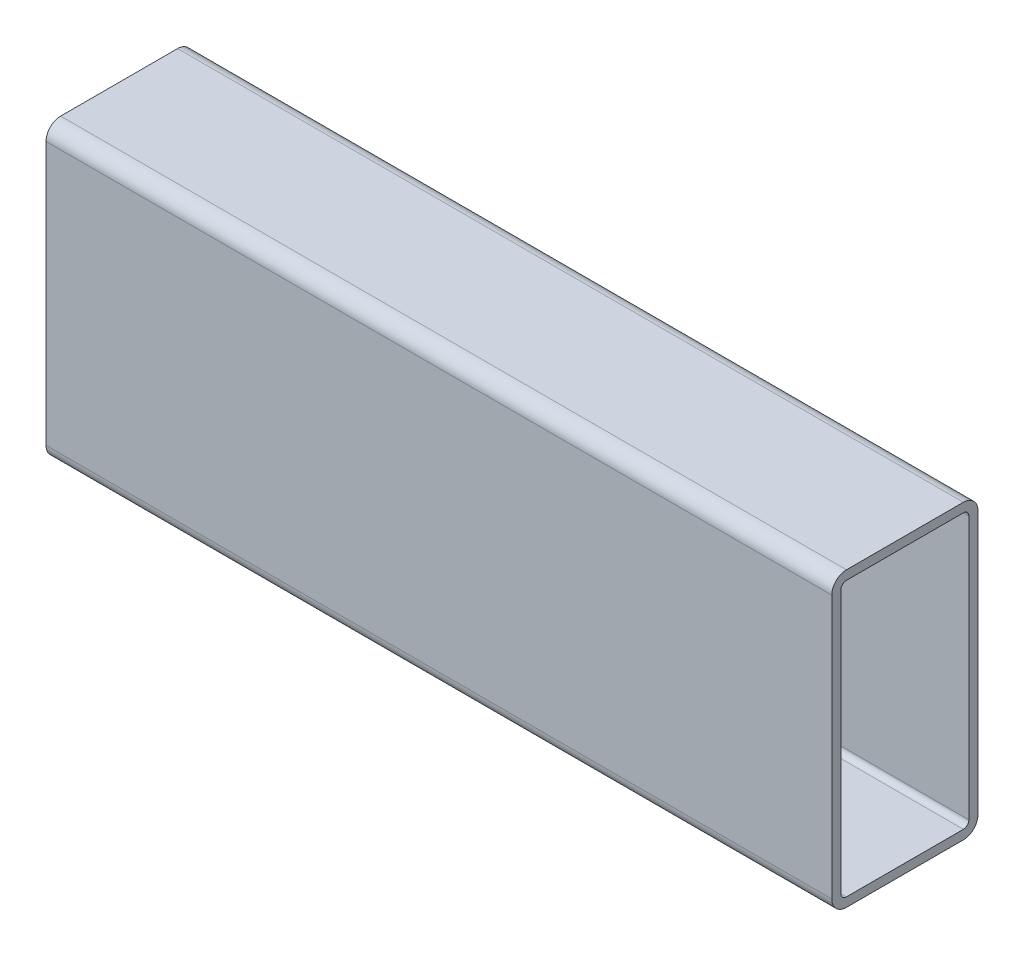
ISO-10303-21;
HEADER;
FILE_DESCRIPTION(('STEP AP214'),'2;1');
FILE_NAME('part.step','',(''),(''),'','','');
FILE_SCHEMA(('AUTOMOTIVE_DESIGN { 1 0 10303 214 1 1 1 1 }'));
ENDSEC;
DATA;
#1=APPLICATION_CONTEXT('core data for automotive mechanical design processes');
#2=APPLICATION_PROTOCOL_DEFINITION('international standard','automotive_design',2000,#1);
#3=PRODUCT_CONTEXT('',#1,'mechanical');
#4=PRODUCT('Part','Part','',(#3));
#5=PRODUCT_RELATED_PRODUCT_CATEGORY('part','',(#4));
#6=PRODUCT_DEFINITION_FORMATION('','',#4);
#7=PRODUCT_DEFINITION_CONTEXT('part definition',#1,'design');
#8=PRODUCT_DEFINITION('design','',#6,#7);
#9=PRODUCT_DEFINITION_SHAPE('','',#8);
#10=(LENGTH_UNIT() NAMED_UNIT(*) SI_UNIT(.MILLI.,.METRE.));
#11=(NAMED_UNIT(*) PLANE_ANGLE_UNIT() SI_UNIT($,.RADIAN.));
#12=(NAMED_UNIT(*) SI_UNIT($,.STERADIAN.) SOLID_ANGLE_UNIT());
#13=UNCERTAINTY_MEASURE_WITH_UNIT(LENGTH_MEASURE(1.E-05),#10,'distance_accuracy_value','');
#14=(GEOMETRIC_REPRESENTATION_CONTEXT(3) GLOBAL_UNCERTAINTY_ASSIGNED_CONTEXT((#13)) GLOBAL_UNIT_ASSIGNED_CONTEXT((#10,
#11,#12)) REPRESENTATION_CONTEXT('',''));
#15=CARTESIAN_POINT('',(0.,0.,0.));
#16=DIRECTION('',(0.,0.,1.));
#17=DIRECTION('',(1.,0.,0.));
#18=AXIS2_PLACEMENT_3D('',#15,#16,#17);
#19=CARTESIAN_POINT('',(68.2625,-22.86,10.16));
#20=DIRECTION('',(1.,0.,0.));
#21=DIRECTION('',(0.,0.,-1.));
#22=AXIS2_PLACEMENT_3D('',#19,#20,#21);
#23=PLANE('',#22);
#24=CARTESIAN_POINT('',(68.2625,-22.86,10.16));
#25=DIRECTION('',(1.,0.,0.));
#26=DIRECTION('',(0.,0.,1.));
#27=AXIS2_PLACEMENT_3D('',#24,#25,#26);
#28=CIRCLE('',#27,2.54);
#29=CARTESIAN_POINT('',(68.2625,-22.86,12.7));
#30=VERTEX_POINT('',#29);
#31=CARTESIAN_POINT('',(68.2625,-25.4,10.16));
#32=VERTEX_POINT('',#31);
#33=EDGE_CURVE('E265',#30,#32,#28,.T.);
#34=ORIENTED_EDGE('',*,*,#33,.T.);
#35=DIRECTION('',(0.,0.,-1.));
#36=VECTOR('',#35,1.);
#37=CARTESIAN_POINT('',(68.2625,-25.4,10.16));
#38=LINE('',#37,#36);
#39=CARTESIAN_POINT('',(68.2625,-25.4,-10.16));
#40=VERTEX_POINT('',#39);
#41=EDGE_CURVE('E268',#32,#40,#38,.T.);
#42=ORIENTED_EDGE('',*,*,#41,.T.);
#43=CARTESIAN_POINT('',(68.2625,-22.86,-10.16));
#44=DIRECTION('',(1.,0.,0.));
#45=DIRECTION('',(0.,0.,-1.));
#46=AXIS2_PLACEMENT_3D('',#43,#44,#45);
#47=CIRCLE('',#46,2.54);
#48=CARTESIAN_POINT('',(68.2625,-22.86,-12.7));
#49=VERTEX_POINT('',#48);
#50=EDGE_CURVE('E271',#40,#49,#47,.T.);
#51=ORIENTED_EDGE('',*,*,#50,.T.);
#52=DIRECTION('',(0.,1.,0.));
#53=VECTOR('',#52,1.);
#54=CARTESIAN_POINT('',(68.2625,-22.86,-12.7));
#55=LINE('',#54,#53);
#56=CARTESIAN_POINT('',(68.2625,22.86,-12.7));
#57=VERTEX_POINT('',#56);
#58=EDGE_CURVE('E273',#49,#57,#55,.T.);
#59=ORIENTED_EDGE('',*,*,#58,.T.);
#60=CARTESIAN_POINT('',(68.2625,22.86,-10.16));
#61=DIRECTION('',(1.,0.,0.));
#62=DIRECTION('',(0.,0.,1.));
#63=AXIS2_PLACEMENT_3D('',#60,#61,#62);
#64=CIRCLE('',#63,2.54);
#65=CARTESIAN_POINT('',(68.2625,25.4,-10.16));
#66=VERTEX_POINT('',#65);
#67=EDGE_CURVE('E275',#57,#66,#64,.T.);
#68=ORIENTED_EDGE('',*,*,#67,.T.);
#69=DIRECTION('',(0.,0.,1.));
#70=VECTOR('',#69,1.);
#71=CARTESIAN_POINT('',(68.2625,25.4,10.16));
#72=LINE('',#71,#70);
#73=CARTESIAN_POINT('',(68.2625,25.4,10.16));
#74=VERTEX_POINT('',#73);
#75=EDGE_CURVE('E277',#66,#74,#72,.T.);
#76=ORIENTED_EDGE('',*,*,#75,.T.);
#77=CARTESIAN_POINT('',(68.2625,22.86,10.16));
#78=DIRECTION('',(1.,0.,0.));
#79=DIRECTION('',(0.,0.,1.));
#80=AXIS2_PLACEMENT_3D('',#77,#78,#79);
#81=CIRCLE('',#80,2.54);
#82=CARTESIAN_POINT('',(68.2625,22.86,12.7));
#83=VERTEX_POINT('',#82);
#84=EDGE_CURVE('E279',#74,#83,#81,.T.);
#85=ORIENTED_EDGE('',*,*,#84,.T.);
#86=DIRECTION('',(0.,-1.,0.));
#87=VECTOR('',#86,1.);
#88=CARTESIAN_POINT('',(68.2625,-22.86,12.7));
#89=LINE('',#88,#87);
#90=EDGE_CURVE('E281',#83,#30,#89,.T.);
#91=ORIENTED_EDGE('',*,*,#90,.T.);
#92=EDGE_LOOP('',(#34,#42,#51,#59,#68,#76,#85,#91));
#93=FACE_BOUND('',#92,.T.);
#94=DIRECTION('',(0.,0.,-1.));
#95=VECTOR('',#94,1.);
#96=CARTESIAN_POINT('',(68.2625,-23.8125,10.16));
#97=LINE('',#96,#95);
#98=CARTESIAN_POINT('',(68.2625,-23.8125,10.16));
#99=VERTEX_POINT('',#98);
#100=CARTESIAN_POINT('',(68.2625,-23.8125,-10.16));
#101=VERTEX_POINT('',#100);
#102=EDGE_CURVE('E208',#99,#101,#97,.T.);
#103=ORIENTED_EDGE('',*,*,#102,.F.);
#104=CARTESIAN_POINT('',(68.2625,-22.86,10.16));
#105=DIRECTION('',(-1.,0.,0.));
#106=DIRECTION('',(0.,0.,1.));
#107=AXIS2_PLACEMENT_3D('',#104,#105,#106);
#108=CIRCLE('',#107,0.952500000000001);
#109=CARTESIAN_POINT('',(68.2625,-22.86,11.1125));
#110=VERTEX_POINT('',#109);
#111=EDGE_CURVE('E200',#110,#99,#108,.F.);
#112=ORIENTED_EDGE('',*,*,#111,.F.);
#113=DIRECTION('',(0.,-1.,0.));
#114=VECTOR('',#113,1.);
#115=CARTESIAN_POINT('',(68.2625,-22.86,11.1125));
#116=LINE('',#115,#114);
#117=CARTESIAN_POINT('',(68.2625,22.86,11.1125));
#118=VERTEX_POINT('',#117);
#119=EDGE_CURVE('E233',#118,#110,#116,.T.);
#120=ORIENTED_EDGE('',*,*,#119,.F.);
#121=CARTESIAN_POINT('',(68.2625,22.86,10.16));
#122=DIRECTION('',(-1.,0.,0.));
#123=DIRECTION('',(0.,0.,1.));
#124=AXIS2_PLACEMENT_3D('',#121,#122,#123);
#125=CIRCLE('',#124,0.952500000000001);
#126=CARTESIAN_POINT('',(68.2625,23.8125,10.16));
#127=VERTEX_POINT('',#126);
#128=EDGE_CURVE('E231',#127,#118,#125,.F.);
#129=ORIENTED_EDGE('',*,*,#128,.F.);
#130=DIRECTION('',(0.,0.,1.));
#131=VECTOR('',#130,1.);
#132=CARTESIAN_POINT('',(68.2625,23.8125,10.16));
#133=LINE('',#132,#131);
#134=CARTESIAN_POINT('',(68.2625,23.8125,-10.16));
#135=VERTEX_POINT('',#134);
#136=EDGE_CURVE('E229',#135,#127,#133,.T.);
#137=ORIENTED_EDGE('',*,*,#136,.F.);
#138=CARTESIAN_POINT('',(68.2625,22.86,-10.16));
#139=DIRECTION('',(-1.,0.,0.));
#140=DIRECTION('',(0.,0.,1.));
#141=AXIS2_PLACEMENT_3D('',#138,#139,#140);
#142=CIRCLE('',#141,0.952500000000001);
#143=CARTESIAN_POINT('',(68.2625,22.86,-11.1125));
#144=VERTEX_POINT('',#143);
#145=EDGE_CURVE('E227',#144,#135,#142,.F.);
#146=ORIENTED_EDGE('',*,*,#145,.F.);
#147=DIRECTION('',(0.,1.,0.));
#148=VECTOR('',#147,1.);
#149=CARTESIAN_POINT('',(68.2625,-22.86,-11.1125));
#150=LINE('',#149,#148);
#151=CARTESIAN_POINT('',(68.2625,-22.86,-11.1125));
#152=VERTEX_POINT('',#151);
#153=EDGE_CURVE('E223',#152,#144,#150,.T.);
#154=ORIENTED_EDGE('',*,*,#153,.F.);
#155=CARTESIAN_POINT('',(68.2625,-22.86,-10.16));
#156=DIRECTION('',(-1.,0.,0.));
#157=DIRECTION('',(0.,0.,1.));
#158=AXIS2_PLACEMENT_3D('',#155,#156,#157);
#159=CIRCLE('',#158,0.952500000000001);
#160=EDGE_CURVE('E221',#101,#152,#159,.F.);
#161=ORIENTED_EDGE('',*,*,#160,.F.);
#162=EDGE_LOOP('',(#103,#112,#120,#129,#137,#146,#154,#161));
#163=FACE_BOUND('',#162,.T.);
#164=ADVANCED_FACE('F87',(#93,#163),#23,.T.);
#165=CARTESIAN_POINT('',(-68.2625,-22.86,10.16));
#166=DIRECTION('',(1.,0.,0.));
#167=DIRECTION('',(0.,0.,-1.));
#168=AXIS2_PLACEMENT_3D('',#165,#166,#167);
#169=PLANE('',#168);
#170=CARTESIAN_POINT('',(-68.2625,-22.86,10.16));
#171=DIRECTION('',(1.,0.,0.));
#172=DIRECTION('',(0.,0.,1.));
#173=AXIS2_PLACEMENT_3D('',#170,#171,#172);
#174=CIRCLE('',#173,2.54);
#175=CARTESIAN_POINT('',(-68.2625,-22.86,12.7));
#176=VERTEX_POINT('',#175);
#177=CARTESIAN_POINT('',(-68.2625,-25.4,10.16));
#178=VERTEX_POINT('',#177);
#179=EDGE_CURVE('E216',#176,#178,#174,.T.);
#180=ORIENTED_EDGE('',*,*,#179,.F.);
#181=DIRECTION('',(0.,-1.,0.));
#182=VECTOR('',#181,1.);
#183=CARTESIAN_POINT('',(-68.2625,-22.86,12.7));
#184=LINE('',#183,#182);
#185=CARTESIAN_POINT('',(-68.2625,22.86,12.7));
#186=VERTEX_POINT('',#185);
#187=EDGE_CURVE('E269',#186,#176,#184,.T.);
#188=ORIENTED_EDGE('',*,*,#187,.F.);
#189=CARTESIAN_POINT('',(-68.2625,22.86,10.16));
#190=DIRECTION('',(1.,0.,0.));
#191=DIRECTION('',(0.,0.,1.));
#192=AXIS2_PLACEMENT_3D('',#189,#190,#191);
#193=CIRCLE('',#192,2.54);
#194=CARTESIAN_POINT('',(-68.2625,25.4,10.16));
#195=VERTEX_POINT('',#194);
#196=EDGE_CURVE('E296',#195,#186,#193,.T.);
#197=ORIENTED_EDGE('',*,*,#196,.F.);
#198=DIRECTION('',(0.,0.,1.));
#199=VECTOR('',#198,1.);
#200=CARTESIAN_POINT('',(-68.2625,25.4,10.16));
#201=LINE('',#200,#199);
#202=CARTESIAN_POINT('',(-68.2625,25.4,-10.16));
#203=VERTEX_POINT('',#202);
#204=EDGE_CURVE('E294',#203,#195,#201,.T.);
#205=ORIENTED_EDGE('',*,*,#204,.F.);
#206=CARTESIAN_POINT('',(-68.2625,22.86,-10.16));
#207=DIRECTION('',(1.,0.,0.));
#208=DIRECTION('',(0.,0.,1.));
#209=AXIS2_PLACEMENT_3D('',#206,#207,#208);
#210=CIRCLE('',#209,2.54);
#211=CARTESIAN_POINT('',(-68.2625,22.86,-12.7));
#212=VERTEX_POINT('',#211);
#213=EDGE_CURVE('E292',#212,#203,#210,.T.);
#214=ORIENTED_EDGE('',*,*,#213,.F.);
#215=DIRECTION('',(0.,1.,0.));
#216=VECTOR('',#215,1.);
#217=CARTESIAN_POINT('',(-68.2625,-22.86,-12.7));
#218=LINE('',#217,#216);
#219=CARTESIAN_POINT('',(-68.2625,-22.86,-12.7));
#220=VERTEX_POINT('',#219);
#221=EDGE_CURVE('E290',#220,#212,#218,.T.);
#222=ORIENTED_EDGE('',*,*,#221,.F.);
#223=CARTESIAN_POINT('',(-68.2625,-22.86,-10.16));
#224=DIRECTION('',(1.,0.,0.));
#225=DIRECTION('',(0.,0.,-1.));
#226=AXIS2_PLACEMENT_3D('',#223,#224,#225);
#227=CIRCLE('',#226,2.54);
#228=CARTESIAN_POINT('',(-68.2625,-25.4,-10.16));
#229=VERTEX_POINT('',#228);
#230=EDGE_CURVE('E288',#229,#220,#227,.T.);
#231=ORIENTED_EDGE('',*,*,#230,.F.);
#232=DIRECTION('',(0.,0.,-1.));
#233=VECTOR('',#232,1.);
#234=CARTESIAN_POINT('',(-68.2625,-25.4,10.16));
#235=LINE('',#234,#233);
#236=EDGE_CURVE('E286',#178,#229,#235,.T.);
#237=ORIENTED_EDGE('',*,*,#236,.F.);
#238=EDGE_LOOP('',(#180,#188,#197,#205,#214,#222,#231,#237));
#239=FACE_BOUND('',#238,.T.);
#240=CARTESIAN_POINT('',(-68.2625,-22.86,10.16));
#241=DIRECTION('',(-1.,0.,0.));
#242=DIRECTION('',(0.,0.,1.));
#243=AXIS2_PLACEMENT_3D('',#240,#241,#242);
#244=CIRCLE('',#243,0.952500000000001);
#245=CARTESIAN_POINT('',(-68.2625,-22.86,11.1125));
#246=VERTEX_POINT('',#245);
#247=CARTESIAN_POINT('',(-68.2625,-23.8125,10.16));
#248=VERTEX_POINT('',#247);
#249=EDGE_CURVE('E110',#246,#248,#244,.F.);
#250=ORIENTED_EDGE('',*,*,#249,.T.);
#251=DIRECTION('',(0.,0.,-1.));
#252=VECTOR('',#251,1.);
#253=CARTESIAN_POINT('',(-68.2625,-23.8125,10.16));
#254=LINE('',#253,#252);
#255=CARTESIAN_POINT('',(-68.2625,-23.8125,-10.16));
#256=VERTEX_POINT('',#255);
#257=EDGE_CURVE('E215',#248,#256,#254,.T.);
#258=ORIENTED_EDGE('',*,*,#257,.T.);
#259=CARTESIAN_POINT('',(-68.2625,-22.86,-10.16));
#260=DIRECTION('',(-1.,0.,0.));
#261=DIRECTION('',(0.,0.,1.));
#262=AXIS2_PLACEMENT_3D('',#259,#260,#261);
#263=CIRCLE('',#262,0.952500000000001);
#264=CARTESIAN_POINT('',(-68.2625,-22.86,-11.1125));
#265=VERTEX_POINT('',#264);
#266=EDGE_CURVE('E237',#256,#265,#263,.F.);
#267=ORIENTED_EDGE('',*,*,#266,.T.);
#268=DIRECTION('',(0.,1.,0.));
#269=VECTOR('',#268,1.);
#270=CARTESIAN_POINT('',(-68.2625,-22.86,-11.1125));
#271=LINE('',#270,#269);
#272=CARTESIAN_POINT('',(-68.2625,22.86,-11.1125));
#273=VERTEX_POINT('',#272);
#274=EDGE_CURVE('E240',#265,#273,#271,.T.);
#275=ORIENTED_EDGE('',*,*,#274,.T.);
#276=CARTESIAN_POINT('',(-68.2625,22.86,-10.16));
#277=DIRECTION('',(-1.,0.,0.));
#278=DIRECTION('',(0.,0.,1.));
#279=AXIS2_PLACEMENT_3D('',#276,#277,#278);
#280=CIRCLE('',#279,0.952500000000001);
#281=CARTESIAN_POINT('',(-68.2625,23.8125,-10.16));
#282=VERTEX_POINT('',#281);
#283=EDGE_CURVE('E243',#273,#282,#280,.F.);
#284=ORIENTED_EDGE('',*,*,#283,.T.);
#285=DIRECTION('',(0.,0.,1.));
#286=VECTOR('',#285,1.);
#287=CARTESIAN_POINT('',(-68.2625,23.8125,10.16));
#288=LINE('',#287,#286);
#289=CARTESIAN_POINT('',(-68.2625,23.8125,10.16));
#290=VERTEX_POINT('',#289);
#291=EDGE_CURVE('E246',#282,#290,#288,.T.);
#292=ORIENTED_EDGE('',*,*,#291,.T.);
#293=CARTESIAN_POINT('',(-68.2625,22.86,10.16));
#294=DIRECTION('',(-1.,0.,0.));
#295=DIRECTION('',(0.,0.,1.));
#296=AXIS2_PLACEMENT_3D('',#293,#294,#295);
#297=CIRCLE('',#296,0.952500000000001);
#298=CARTESIAN_POINT('',(-68.2625,22.86,11.1125));
#299=VERTEX_POINT('',#298);
#300=EDGE_CURVE('E249',#290,#299,#297,.F.);
#301=ORIENTED_EDGE('',*,*,#300,.T.);
#302=DIRECTION('',(0.,-1.,0.));
#303=VECTOR('',#302,1.);
#304=CARTESIAN_POINT('',(-68.2625,-22.86,11.1125));
#305=LINE('',#304,#303);
#306=EDGE_CURVE('E209',#299,#246,#305,.T.);
#307=ORIENTED_EDGE('',*,*,#306,.T.);
#308=EDGE_LOOP('',(#250,#258,#267,#275,#284,#292,#301,#307));
#309=FACE_BOUND('',#308,.T.);
#310=ADVANCED_FACE('F326',(#239,#309),#169,.F.);
#311=CARTESIAN_POINT('',(68.2625,-22.86,10.16));
#312=DIRECTION('',(-1.,0.,0.));
#313=DIRECTION('',(0.,0.,1.));
#314=AXIS2_PLACEMENT_3D('',#311,#312,#313);
#315=CYLINDRICAL_SURFACE('',#314,2.54);
#316=ORIENTED_EDGE('',*,*,#179,.T.);
#317=DIRECTION('',(-1.,0.,0.));
#318=VECTOR('',#317,1.);
#319=CARTESIAN_POINT('',(68.2625,-25.4,10.16));
#320=LINE('',#319,#318);
#321=EDGE_CURVE('E12',#32,#178,#320,.T.);
#322=ORIENTED_EDGE('',*,*,#321,.F.);
#323=ORIENTED_EDGE('',*,*,#33,.F.);
#324=DIRECTION('',(-1.,0.,0.));
#325=VECTOR('',#324,1.);
#326=CARTESIAN_POINT('',(68.2625,-22.86,12.7));
#327=LINE('',#326,#325);
#328=EDGE_CURVE('E283',#30,#176,#327,.T.);
#329=ORIENTED_EDGE('',*,*,#328,.T.);
#330=EDGE_LOOP('',(#316,#322,#323,#329));
#331=FACE_BOUND('',#330,.T.);
#332=ADVANCED_FACE('F89',(#331),#315,.T.);
#333=CARTESIAN_POINT('',(68.2625,-25.4,10.16));
#334=DIRECTION('',(0.,1.,0.));
#335=DIRECTION('',(0.,0.,1.));
#336=AXIS2_PLACEMENT_3D('',#333,#334,#335);
#337=PLANE('',#336);
#338=ORIENTED_EDGE('',*,*,#236,.T.);
#339=DIRECTION('',(-1.,0.,0.));
#340=VECTOR('',#339,1.);
#341=CARTESIAN_POINT('',(68.2625,-25.4,-10.16));
#342=LINE('',#341,#340);
#343=EDGE_CURVE('E95',#40,#229,#342,.T.);
#344=ORIENTED_EDGE('',*,*,#343,.F.);
#345=ORIENTED_EDGE('',*,*,#41,.F.);
#346=ORIENTED_EDGE('',*,*,#321,.T.);
#347=EDGE_LOOP('',(#338,#344,#345,#346));
#348=FACE_BOUND('',#347,.T.);
#349=ADVANCED_FACE('F343',(#348),#337,.F.);
#350=CARTESIAN_POINT('',(68.2625,-22.86,-10.16));
#351=DIRECTION('',(-1.,0.,0.));
#352=DIRECTION('',(0.,0.,1.));
#353=AXIS2_PLACEMENT_3D('',#350,#351,#352);
#354=CYLINDRICAL_SURFACE('',#353,2.54);
#355=ORIENTED_EDGE('',*,*,#230,.T.);
#356=DIRECTION('',(-1.,0.,0.));
#357=VECTOR('',#356,1.);
#358=CARTESIAN_POINT('',(68.2625,-22.86,-12.7));
#359=LINE('',#358,#357);
#360=EDGE_CURVE('E313',#49,#220,#359,.T.);
#361=ORIENTED_EDGE('',*,*,#360,.F.);
#362=ORIENTED_EDGE('',*,*,#50,.F.);
#363=ORIENTED_EDGE('',*,*,#343,.T.);
#364=EDGE_LOOP('',(#355,#361,#362,#363));
#365=FACE_BOUND('',#364,.T.);
#366=ADVANCED_FACE('F320',(#365),#354,.T.);
#367=CARTESIAN_POINT('',(68.2625,-22.86,-12.7));
#368=DIRECTION('',(0.,0.,1.));
#369=DIRECTION('',(0.,-1.,0.));
#370=AXIS2_PLACEMENT_3D('',#367,#368,#369);
#371=PLANE('',#370);
#372=ORIENTED_EDGE('',*,*,#221,.T.);
#373=DIRECTION('',(-1.,0.,0.));
#374=VECTOR('',#373,1.);
#375=CARTESIAN_POINT('',(68.2625,22.86,-12.7));
#376=LINE('',#375,#374);
#377=EDGE_CURVE('E310',#57,#212,#376,.T.);
#378=ORIENTED_EDGE('',*,*,#377,.F.);
#379=ORIENTED_EDGE('',*,*,#58,.F.);
#380=ORIENTED_EDGE('',*,*,#360,.T.);
#381=EDGE_LOOP('',(#372,#378,#379,#380));
#382=FACE_BOUND('',#381,.T.);
#383=ADVANCED_FACE('F332',(#382),#371,.F.);
#384=CARTESIAN_POINT('',(68.2625,22.86,-10.16));
#385=DIRECTION('',(-1.,0.,0.));
#386=DIRECTION('',(0.,0.,1.));
#387=AXIS2_PLACEMENT_3D('',#384,#385,#386);
#388=CYLINDRICAL_SURFACE('',#387,2.54);
#389=ORIENTED_EDGE('',*,*,#213,.T.);
#390=DIRECTION('',(-1.,0.,0.));
#391=VECTOR('',#390,1.);
#392=CARTESIAN_POINT('',(68.2625,25.4,-10.16));
#393=LINE('',#392,#391);
#394=EDGE_CURVE('E307',#66,#203,#393,.T.);
#395=ORIENTED_EDGE('',*,*,#394,.F.);
#396=ORIENTED_EDGE('',*,*,#67,.F.);
#397=ORIENTED_EDGE('',*,*,#377,.T.);
#398=EDGE_LOOP('',(#389,#395,#396,#397));
#399=FACE_BOUND('',#398,.T.);
#400=ADVANCED_FACE('F336',(#399),#388,.T.);
#401=CARTESIAN_POINT('',(68.2625,25.4,10.16));
#402=DIRECTION('',(0.,-1.,0.));
#403=DIRECTION('',(0.,0.,-1.));
#404=AXIS2_PLACEMENT_3D('',#401,#402,#403);
#405=PLANE('',#404);
#406=ORIENTED_EDGE('',*,*,#204,.T.);
#407=DIRECTION('',(-1.,0.,0.));
#408=VECTOR('',#407,1.);
#409=CARTESIAN_POINT('',(68.2625,25.4,10.16));
#410=LINE('',#409,#408);
#411=EDGE_CURVE('E304',#74,#195,#410,.T.);
#412=ORIENTED_EDGE('',*,*,#411,.F.);
#413=ORIENTED_EDGE('',*,*,#75,.F.);
#414=ORIENTED_EDGE('',*,*,#394,.T.);
#415=EDGE_LOOP('',(#406,#412,#413,#414));
#416=FACE_BOUND('',#415,.T.);
#417=ADVANCED_FACE('F356',(#416),#405,.F.);
#418=CARTESIAN_POINT('',(68.2625,22.86,10.16));
#419=DIRECTION('',(-1.,0.,0.));
#420=DIRECTION('',(0.,0.,1.));
#421=AXIS2_PLACEMENT_3D('',#418,#419,#420);
#422=CYLINDRICAL_SURFACE('',#421,2.54);
#423=ORIENTED_EDGE('',*,*,#196,.T.);
#424=DIRECTION('',(-1.,0.,0.));
#425=VECTOR('',#424,1.);
#426=CARTESIAN_POINT('',(68.2625,22.86,12.7));
#427=LINE('',#426,#425);
#428=EDGE_CURVE('E301',#83,#186,#427,.T.);
#429=ORIENTED_EDGE('',*,*,#428,.F.);
#430=ORIENTED_EDGE('',*,*,#84,.F.);
#431=ORIENTED_EDGE('',*,*,#411,.T.);
#432=EDGE_LOOP('',(#423,#429,#430,#431));
#433=FACE_BOUND('',#432,.T.);
#434=ADVANCED_FACE('F354',(#433),#422,.T.);
#435=CARTESIAN_POINT('',(68.2625,-22.86,12.7));
#436=DIRECTION('',(0.,0.,-1.));
#437=DIRECTION('',(-1.,0.,0.));
#438=AXIS2_PLACEMENT_3D('',#435,#436,#437);
#439=PLANE('',#438);
#440=ORIENTED_EDGE('',*,*,#187,.T.);
#441=ORIENTED_EDGE('',*,*,#328,.F.);
#442=ORIENTED_EDGE('',*,*,#90,.F.);
#443=ORIENTED_EDGE('',*,*,#428,.T.);
#444=EDGE_LOOP('',(#440,#441,#442,#443));
#445=FACE_BOUND('',#444,.T.);
#446=ADVANCED_FACE('F349',(#445),#439,.F.);
#447=CARTESIAN_POINT('',(68.2625,-22.86,10.16));
#448=DIRECTION('',(-1.,0.,0.));
#449=DIRECTION('',(0.,0.,1.));
#450=AXIS2_PLACEMENT_3D('',#447,#448,#449);
#451=CYLINDRICAL_SURFACE('',#450,0.952500000000001);
#452=ORIENTED_EDGE('',*,*,#249,.F.);
#453=DIRECTION('',(-1.,0.,0.));
#454=VECTOR('',#453,1.);
#455=CARTESIAN_POINT('',(68.2625,-22.86,11.1125));
#456=LINE('',#455,#454);
#457=EDGE_CURVE('E204',#110,#246,#456,.T.);
#458=ORIENTED_EDGE('',*,*,#457,.F.);
#459=ORIENTED_EDGE('',*,*,#111,.T.);
#460=DIRECTION('',(-1.,0.,0.));
#461=VECTOR('',#460,1.);
#462=CARTESIAN_POINT('',(68.2625,-23.8125,10.16));
#463=LINE('',#462,#461);
#464=EDGE_CURVE('E203',#99,#248,#463,.T.);
#465=ORIENTED_EDGE('',*,*,#464,.T.);
#466=EDGE_LOOP('',(#452,#458,#459,#465));
#467=FACE_BOUND('',#466,.T.);
#468=ADVANCED_FACE('F202',(#467),#451,.F.);
#469=CARTESIAN_POINT('',(68.2625,-23.8125,10.16));
#470=DIRECTION('',(0.,1.,0.));
#471=DIRECTION('',(0.,0.,1.));
#472=AXIS2_PLACEMENT_3D('',#469,#470,#471);
#473=PLANE('',#472);
#474=ORIENTED_EDGE('',*,*,#257,.F.);
#475=ORIENTED_EDGE('',*,*,#464,.F.);
#476=ORIENTED_EDGE('',*,*,#102,.T.);
#477=DIRECTION('',(-1.,0.,0.));
#478=VECTOR('',#477,1.);
#479=CARTESIAN_POINT('',(68.2625,-23.8125,-10.16));
#480=LINE('',#479,#478);
#481=EDGE_CURVE('E217',#101,#256,#480,.T.);
#482=ORIENTED_EDGE('',*,*,#481,.T.);
#483=EDGE_LOOP('',(#474,#475,#476,#482));
#484=FACE_BOUND('',#483,.T.);
#485=ADVANCED_FACE('F212',(#484),#473,.T.);
#486=CARTESIAN_POINT('',(68.2625,-22.86,-10.16));
#487=DIRECTION('',(-1.,0.,0.));
#488=DIRECTION('',(0.,0.,1.));
#489=AXIS2_PLACEMENT_3D('',#486,#487,#488);
#490=CYLINDRICAL_SURFACE('',#489,0.952500000000001);
#491=ORIENTED_EDGE('',*,*,#266,.F.);
#492=ORIENTED_EDGE('',*,*,#481,.F.);
#493=ORIENTED_EDGE('',*,*,#160,.T.);
#494=DIRECTION('',(-1.,0.,0.));
#495=VECTOR('',#494,1.);
#496=CARTESIAN_POINT('',(68.2625,-22.86,-11.1125));
#497=LINE('',#496,#495);
#498=EDGE_CURVE('E262',#152,#265,#497,.T.);
#499=ORIENTED_EDGE('',*,*,#498,.T.);
#500=EDGE_LOOP('',(#491,#492,#493,#499));
#501=FACE_BOUND('',#500,.T.);
#502=ADVANCED_FACE('F381',(#501),#490,.F.);
#503=CARTESIAN_POINT('',(68.2625,-22.86,-11.1125));
#504=DIRECTION('',(0.,0.,1.));
#505=DIRECTION('',(0.,-1.,0.));
#506=AXIS2_PLACEMENT_3D('',#503,#504,#505);
#507=PLANE('',#506);
#508=ORIENTED_EDGE('',*,*,#274,.F.);
#509=ORIENTED_EDGE('',*,*,#498,.F.);
#510=ORIENTED_EDGE('',*,*,#153,.T.);
#511=DIRECTION('',(-1.,0.,0.));
#512=VECTOR('',#511,1.);
#513=CARTESIAN_POINT('',(68.2625,22.86,-11.1125));
#514=LINE('',#513,#512);
#515=EDGE_CURVE('E260',#144,#273,#514,.T.);
#516=ORIENTED_EDGE('',*,*,#515,.T.);
#517=EDGE_LOOP('',(#508,#509,#510,#516));
#518=FACE_BOUND('',#517,.T.);
#519=ADVANCED_FACE('F385',(#518),#507,.T.);
#520=CARTESIAN_POINT('',(68.2625,22.86,-10.16));
#521=DIRECTION('',(-1.,0.,0.));
#522=DIRECTION('',(0.,0.,1.));
#523=AXIS2_PLACEMENT_3D('',#520,#521,#522);
#524=CYLINDRICAL_SURFACE('',#523,0.952500000000001);
#525=ORIENTED_EDGE('',*,*,#283,.F.);
#526=ORIENTED_EDGE('',*,*,#515,.F.);
#527=ORIENTED_EDGE('',*,*,#145,.T.);
#528=DIRECTION('',(-1.,0.,0.));
#529=VECTOR('',#528,1.);
#530=CARTESIAN_POINT('',(68.2625,23.8125,-10.16));
#531=LINE('',#530,#529);
#532=EDGE_CURVE('E258',#135,#282,#531,.T.);
#533=ORIENTED_EDGE('',*,*,#532,.T.);
#534=EDGE_LOOP('',(#525,#526,#527,#533));
#535=FACE_BOUND('',#534,.T.);
#536=ADVANCED_FACE('F391',(#535),#524,.F.);
#537=CARTESIAN_POINT('',(68.2625,23.8125,10.16));
#538=DIRECTION('',(0.,-1.,0.));
#539=DIRECTION('',(0.,0.,-1.));
#540=AXIS2_PLACEMENT_3D('',#537,#538,#539);
#541=PLANE('',#540);
#542=ORIENTED_EDGE('',*,*,#291,.F.);
#543=ORIENTED_EDGE('',*,*,#532,.F.);
#544=ORIENTED_EDGE('',*,*,#136,.T.);
#545=DIRECTION('',(-1.,0.,0.));
#546=VECTOR('',#545,1.);
#547=CARTESIAN_POINT('',(68.2625,23.8125,10.16));
#548=LINE('',#547,#546);
#549=EDGE_CURVE('E256',#127,#290,#548,.T.);
#550=ORIENTED_EDGE('',*,*,#549,.T.);
#551=EDGE_LOOP('',(#542,#543,#544,#550));
#552=FACE_BOUND('',#551,.T.);
#553=ADVANCED_FACE('F395',(#552),#541,.T.);
#554=CARTESIAN_POINT('',(68.2625,22.86,10.16));
#555=DIRECTION('',(-1.,0.,0.));
#556=DIRECTION('',(0.,0.,1.));
#557=AXIS2_PLACEMENT_3D('',#554,#555,#556);
#558=CYLINDRICAL_SURFACE('',#557,0.952500000000001);
#559=ORIENTED_EDGE('',*,*,#300,.F.);
#560=ORIENTED_EDGE('',*,*,#549,.F.);
#561=ORIENTED_EDGE('',*,*,#128,.T.);
#562=DIRECTION('',(-1.,0.,0.));
#563=VECTOR('',#562,1.);
#564=CARTESIAN_POINT('',(68.2625,22.86,11.1125));
#565=LINE('',#564,#563);
#566=EDGE_CURVE('E102',#118,#299,#565,.T.);
#567=ORIENTED_EDGE('',*,*,#566,.T.);
#568=EDGE_LOOP('',(#559,#560,#561,#567));
#569=FACE_BOUND('',#568,.T.);
#570=ADVANCED_FACE('F399',(#569),#558,.F.);
#571=CARTESIAN_POINT('',(68.2625,-22.86,11.1125));
#572=DIRECTION('',(0.,0.,-1.));
#573=DIRECTION('',(-1.,0.,0.));
#574=AXIS2_PLACEMENT_3D('',#571,#572,#573);
#575=PLANE('',#574);
#576=ORIENTED_EDGE('',*,*,#306,.F.);
#577=ORIENTED_EDGE('',*,*,#566,.F.);
#578=ORIENTED_EDGE('',*,*,#119,.T.);
#579=ORIENTED_EDGE('',*,*,#457,.T.);
#580=EDGE_LOOP('',(#576,#577,#578,#579));
#581=FACE_BOUND('',#580,.T.);
#582=ADVANCED_FACE('F403',(#581),#575,.T.);
#583=CLOSED_SHELL('',(#164,#310,#332,#349,#366,#383,#400,#417,#434,#446,#468,#485,#502,#519,
#536,#553,#570,#582));
#584=MANIFOLD_SOLID_BREP('B2',#583);
#585=ADVANCED_BREP_SHAPE_REPRESENTATION('',(#18,#584),#14);
#586=SHAPE_DEFINITION_REPRESENTATION(#9,#585);
ENDSEC;
END-ISO-10303-21;
